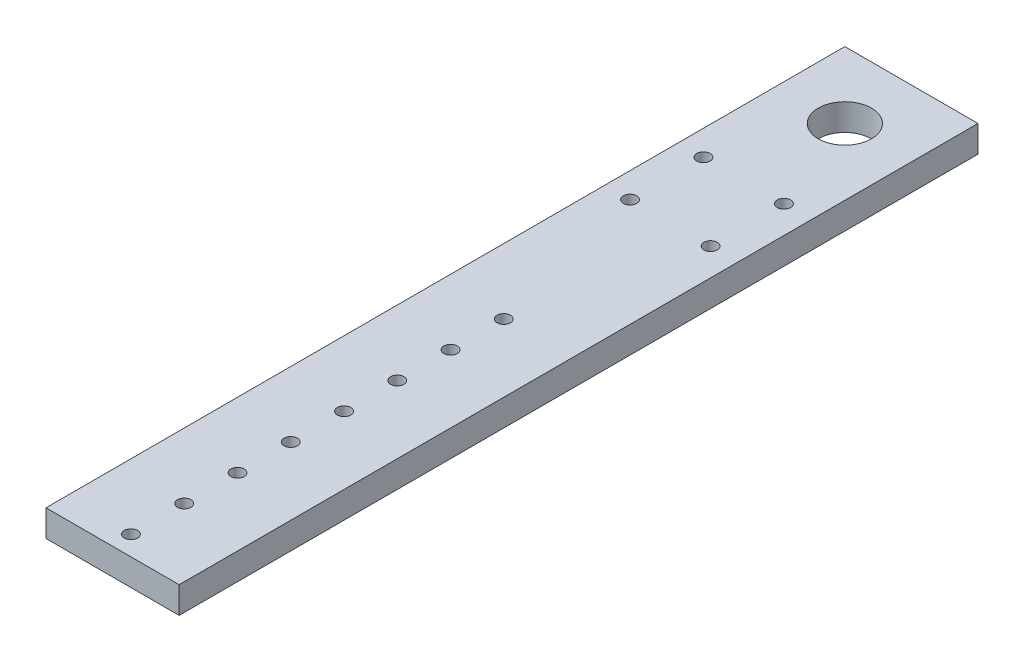
ISO-10303-21;
HEADER;
FILE_DESCRIPTION(('STEP AP214'),'2;1');
FILE_NAME('part.step','',(''),(''),'','','');
FILE_SCHEMA(('AUTOMOTIVE_DESIGN { 1 0 10303 214 1 1 1 1 }'));
ENDSEC;
DATA;
#1=APPLICATION_CONTEXT('core data for automotive mechanical design processes');
#2=APPLICATION_PROTOCOL_DEFINITION('international standard','automotive_design',2000,#1);
#3=PRODUCT_CONTEXT('',#1,'mechanical');
#4=PRODUCT('Part','Part','',(#3));
#5=PRODUCT_RELATED_PRODUCT_CATEGORY('part','',(#4));
#6=PRODUCT_DEFINITION_FORMATION('','',#4);
#7=PRODUCT_DEFINITION_CONTEXT('part definition',#1,'design');
#8=PRODUCT_DEFINITION('design','',#6,#7);
#9=PRODUCT_DEFINITION_SHAPE('','',#8);
#10=(LENGTH_UNIT() NAMED_UNIT(*) SI_UNIT(.MILLI.,.METRE.));
#11=(NAMED_UNIT(*) PLANE_ANGLE_UNIT() SI_UNIT($,.RADIAN.));
#12=(NAMED_UNIT(*) SI_UNIT($,.STERADIAN.) SOLID_ANGLE_UNIT());
#13=UNCERTAINTY_MEASURE_WITH_UNIT(LENGTH_MEASURE(1.E-05),#10,'distance_accuracy_value','');
#14=(GEOMETRIC_REPRESENTATION_CONTEXT(3) GLOBAL_UNCERTAINTY_ASSIGNED_CONTEXT((#13)) GLOBAL_UNIT_ASSIGNED_CONTEXT((#10,
#11,#12)) REPRESENTATION_CONTEXT('',''));
#15=CARTESIAN_POINT('',(0.,0.,0.));
#16=DIRECTION('',(0.,0.,1.));
#17=DIRECTION('',(1.,0.,0.));
#18=AXIS2_PLACEMENT_3D('',#15,#16,#17);
#19=CARTESIAN_POINT('',(0.,25.4,0.));
#20=DIRECTION('',(-1.,0.,0.));
#21=DIRECTION('',(0.,0.,1.));
#22=AXIS2_PLACEMENT_3D('',#19,#20,#21);
#23=PLANE('',#22);
#24=DIRECTION('',(0.,0.,-1.));
#25=VECTOR('',#24,1.);
#26=CARTESIAN_POINT('',(0.,0.,0.));
#27=LINE('',#26,#25);
#28=CARTESIAN_POINT('',(0.,0.,0.));
#29=VERTEX_POINT('',#28);
#30=CARTESIAN_POINT('',(0.,0.,-762.));
#31=VERTEX_POINT('',#30);
#32=EDGE_CURVE('E96',#29,#31,#27,.T.);
#33=ORIENTED_EDGE('',*,*,#32,.T.);
#34=DIRECTION('',(0.,-1.,0.));
#35=VECTOR('',#34,1.);
#36=CARTESIAN_POINT('',(0.,25.4,-762.));
#37=LINE('',#36,#35);
#38=CARTESIAN_POINT('',(0.,25.4,-762.));
#39=VERTEX_POINT('',#38);
#40=EDGE_CURVE('E11',#39,#31,#37,.T.);
#41=ORIENTED_EDGE('',*,*,#40,.F.);
#42=DIRECTION('',(0.,0.,-1.));
#43=VECTOR('',#42,1.);
#44=CARTESIAN_POINT('',(0.,25.4,0.));
#45=LINE('',#44,#43);
#46=CARTESIAN_POINT('',(0.,25.4,0.));
#47=VERTEX_POINT('',#46);
#48=EDGE_CURVE('E82',#47,#39,#45,.T.);
#49=ORIENTED_EDGE('',*,*,#48,.F.);
#50=DIRECTION('',(0.,-1.,0.));
#51=VECTOR('',#50,1.);
#52=CARTESIAN_POINT('',(0.,25.4,0.));
#53=LINE('',#52,#51);
#54=EDGE_CURVE('E49',#47,#29,#53,.T.);
#55=ORIENTED_EDGE('',*,*,#54,.T.);
#56=EDGE_LOOP('',(#33,#41,#49,#55));
#57=FACE_BOUND('',#56,.T.);
#58=ADVANCED_FACE('F33',(#57),#23,.F.);
#59=CARTESIAN_POINT('',(0.,25.4,-762.));
#60=DIRECTION('',(0.,0.,1.));
#61=DIRECTION('',(1.,0.,0.));
#62=AXIS2_PLACEMENT_3D('',#59,#60,#61);
#63=PLANE('',#62);
#64=DIRECTION('',(-1.,0.,0.));
#65=VECTOR('',#64,1.);
#66=CARTESIAN_POINT('',(0.,0.,-762.));
#67=LINE('',#66,#65);
#68=CARTESIAN_POINT('',(-127.,0.,-762.));
#69=VERTEX_POINT('',#68);
#70=EDGE_CURVE('E87',#31,#69,#67,.T.);
#71=ORIENTED_EDGE('',*,*,#70,.T.);
#72=DIRECTION('',(0.,-1.,0.));
#73=VECTOR('',#72,1.);
#74=CARTESIAN_POINT('',(-127.,25.4,-762.));
#75=LINE('',#74,#73);
#76=CARTESIAN_POINT('',(-127.,25.4,-762.));
#77=VERTEX_POINT('',#76);
#78=EDGE_CURVE('E41',#77,#69,#75,.T.);
#79=ORIENTED_EDGE('',*,*,#78,.F.);
#80=DIRECTION('',(-1.,0.,0.));
#81=VECTOR('',#80,1.);
#82=CARTESIAN_POINT('',(0.,25.4,-762.));
#83=LINE('',#82,#81);
#84=EDGE_CURVE('E74',#39,#77,#83,.T.);
#85=ORIENTED_EDGE('',*,*,#84,.F.);
#86=ORIENTED_EDGE('',*,*,#40,.T.);
#87=EDGE_LOOP('',(#71,#79,#85,#86));
#88=FACE_BOUND('',#87,.T.);
#89=ADVANCED_FACE('F86',(#88),#63,.F.);
#90=CARTESIAN_POINT('',(-127.,25.4,0.));
#91=DIRECTION('',(-1.,0.,0.));
#92=DIRECTION('',(0.,0.,1.));
#93=AXIS2_PLACEMENT_3D('',#90,#91,#92);
#94=PLANE('',#93);
#95=DIRECTION('',(0.,0.,-1.));
#96=VECTOR('',#95,1.);
#97=CARTESIAN_POINT('',(-127.,0.,0.));
#98=LINE('',#97,#96);
#99=CARTESIAN_POINT('',(-127.,0.,0.));
#100=VERTEX_POINT('',#99);
#101=EDGE_CURVE('E100',#100,#69,#98,.T.);
#102=ORIENTED_EDGE('',*,*,#101,.F.);
#103=DIRECTION('',(0.,-1.,0.));
#104=VECTOR('',#103,1.);
#105=CARTESIAN_POINT('',(-127.,25.4,0.));
#106=LINE('',#105,#104);
#107=CARTESIAN_POINT('',(-127.,25.4,0.));
#108=VERTEX_POINT('',#107);
#109=EDGE_CURVE('E63',#108,#100,#106,.T.);
#110=ORIENTED_EDGE('',*,*,#109,.F.);
#111=DIRECTION('',(0.,0.,-1.));
#112=VECTOR('',#111,1.);
#113=CARTESIAN_POINT('',(-127.,25.4,0.));
#114=LINE('',#113,#112);
#115=EDGE_CURVE('E81',#108,#77,#114,.T.);
#116=ORIENTED_EDGE('',*,*,#115,.T.);
#117=ORIENTED_EDGE('',*,*,#78,.T.);
#118=EDGE_LOOP('',(#102,#110,#116,#117));
#119=FACE_BOUND('',#118,.T.);
#120=ADVANCED_FACE('F90',(#119),#94,.T.);
#121=CARTESIAN_POINT('',(0.,25.4,0.));
#122=DIRECTION('',(0.,0.,1.));
#123=DIRECTION('',(1.,0.,0.));
#124=AXIS2_PLACEMENT_3D('',#121,#122,#123);
#125=PLANE('',#124);
#126=DIRECTION('',(-1.,0.,0.));
#127=VECTOR('',#126,1.);
#128=CARTESIAN_POINT('',(0.,0.,0.));
#129=LINE('',#128,#127);
#130=EDGE_CURVE('E102',#29,#100,#129,.T.);
#131=ORIENTED_EDGE('',*,*,#130,.F.);
#132=ORIENTED_EDGE('',*,*,#54,.F.);
#133=DIRECTION('',(-1.,0.,0.));
#134=VECTOR('',#133,1.);
#135=CARTESIAN_POINT('',(0.,25.4,0.));
#136=LINE('',#135,#134);
#137=EDGE_CURVE('E91',#47,#108,#136,.T.);
#138=ORIENTED_EDGE('',*,*,#137,.T.);
#139=ORIENTED_EDGE('',*,*,#109,.T.);
#140=EDGE_LOOP('',(#131,#132,#138,#139));
#141=FACE_BOUND('',#140,.T.);
#142=ADVANCED_FACE('F191',(#141),#125,.T.);
#143=CARTESIAN_POINT('',(0.,25.4,0.));
#144=DIRECTION('',(0.,1.,0.));
#145=DIRECTION('',(0.,0.,1.));
#146=AXIS2_PLACEMENT_3D('',#143,#144,#145);
#147=PLANE('',#146);
#148=CARTESIAN_POINT('',(-103.026104377343,25.4,-603.131071739426));
#149=DIRECTION('',(0.,1.,0.));
#150=DIRECTION('',(0.,0.,1.));
#151=AXIS2_PLACEMENT_3D('',#148,#149,#150);
#152=CIRCLE('',#151,6.34999999999999);
#153=CARTESIAN_POINT('',(-103.026104377343,25.4,-596.781071739426));
#154=VERTEX_POINT('',#153);
#155=EDGE_CURVE('E182',#154,#154,#152,.T.);
#156=ORIENTED_EDGE('',*,*,#155,.F.);
#157=EDGE_LOOP('',(#156));
#158=FACE_BOUND('',#157,.T.);
#159=CARTESIAN_POINT('',(-64.6204470928531,25.4,-374.28850318734));
#160=DIRECTION('',(0.,1.,0.));
#161=DIRECTION('',(0.,0.,1.));
#162=AXIS2_PLACEMENT_3D('',#159,#160,#161);
#163=CIRCLE('',#162,6.34999999999999);
#164=CARTESIAN_POINT('',(-64.6204470928531,25.4,-367.93850318734));
#165=VERTEX_POINT('',#164);
#166=EDGE_CURVE('E176',#165,#165,#163,.T.);
#167=ORIENTED_EDGE('',*,*,#166,.F.);
#168=EDGE_LOOP('',(#167));
#169=FACE_BOUND('',#168,.T.);
#170=CARTESIAN_POINT('',(-26.214789808363,25.4,-603.131071739426));
#171=DIRECTION('',(0.,1.,0.));
#172=DIRECTION('',(0.,0.,1.));
#173=AXIS2_PLACEMENT_3D('',#170,#171,#172);
#174=CIRCLE('',#173,6.34999999999999);
#175=CARTESIAN_POINT('',(-26.214789808363,25.4,-596.781071739426));
#176=VERTEX_POINT('',#175);
#177=EDGE_CURVE('E170',#176,#176,#174,.T.);
#178=ORIENTED_EDGE('',*,*,#177,.F.);
#179=EDGE_LOOP('',(#178));
#180=FACE_BOUND('',#179,.T.);
#181=CARTESIAN_POINT('',(-26.2147898083632,25.4,-533.157431447913));
#182=DIRECTION('',(0.,1.,0.));
#183=DIRECTION('',(0.,0.,1.));
#184=AXIS2_PLACEMENT_3D('',#181,#182,#183);
#185=CIRCLE('',#184,6.34999999999999);
#186=CARTESIAN_POINT('',(-26.2147898083632,25.4,-526.807431447913));
#187=VERTEX_POINT('',#186);
#188=EDGE_CURVE('E164',#187,#187,#185,.T.);
#189=ORIENTED_EDGE('',*,*,#188,.F.);
#190=EDGE_LOOP('',(#189));
#191=FACE_BOUND('',#190,.T.);
#192=CARTESIAN_POINT('',(-103.026104377343,25.4,-533.157431447913));
#193=DIRECTION('',(0.,1.,0.));
#194=DIRECTION('',(0.,0.,1.));
#195=AXIS2_PLACEMENT_3D('',#192,#193,#194);
#196=CIRCLE('',#195,6.34999999999998);
#197=CARTESIAN_POINT('',(-103.026104377343,25.4,-526.807431447913));
#198=VERTEX_POINT('',#197);
#199=EDGE_CURVE('E158',#198,#198,#196,.T.);
#200=ORIENTED_EDGE('',*,*,#199,.F.);
#201=EDGE_LOOP('',(#200));
#202=FACE_BOUND('',#201,.T.);
#203=CARTESIAN_POINT('',(-64.6204470928526,25.4,-323.48850318734));
#204=DIRECTION('',(0.,1.,0.));
#205=DIRECTION('',(0.,0.,1.));
#206=AXIS2_PLACEMENT_3D('',#203,#204,#205);
#207=CIRCLE('',#206,6.34999999999999);
#208=CARTESIAN_POINT('',(-64.6204470928526,25.4,-317.13850318734));
#209=VERTEX_POINT('',#208);
#210=EDGE_CURVE('E152',#209,#209,#207,.T.);
#211=ORIENTED_EDGE('',*,*,#210,.F.);
#212=EDGE_LOOP('',(#211));
#213=FACE_BOUND('',#212,.T.);
#214=CARTESIAN_POINT('',(-64.620447092852,25.4,-272.68850318734));
#215=DIRECTION('',(0.,1.,0.));
#216=DIRECTION('',(0.,0.,1.));
#217=AXIS2_PLACEMENT_3D('',#214,#215,#216);
#218=CIRCLE('',#217,6.34999999999999);
#219=CARTESIAN_POINT('',(-64.620447092852,25.4,-266.33850318734));
#220=VERTEX_POINT('',#219);
#221=EDGE_CURVE('E146',#220,#220,#218,.T.);
#222=ORIENTED_EDGE('',*,*,#221,.F.);
#223=EDGE_LOOP('',(#222));
#224=FACE_BOUND('',#223,.T.);
#225=CARTESIAN_POINT('',(-64.6204470928515,25.4,-221.88850318734));
#226=DIRECTION('',(0.,1.,0.));
#227=DIRECTION('',(0.,0.,1.));
#228=AXIS2_PLACEMENT_3D('',#225,#226,#227);
#229=CIRCLE('',#228,6.34999999999999);
#230=CARTESIAN_POINT('',(-64.6204470928515,25.4,-215.53850318734));
#231=VERTEX_POINT('',#230);
#232=EDGE_CURVE('E140',#231,#231,#229,.T.);
#233=ORIENTED_EDGE('',*,*,#232,.F.);
#234=EDGE_LOOP('',(#233));
#235=FACE_BOUND('',#234,.T.);
#236=CARTESIAN_POINT('',(-64.620447092851,25.4,-171.08850318734));
#237=DIRECTION('',(0.,1.,0.));
#238=DIRECTION('',(0.,0.,1.));
#239=AXIS2_PLACEMENT_3D('',#236,#237,#238);
#240=CIRCLE('',#239,6.34999999999999);
#241=CARTESIAN_POINT('',(-64.620447092851,25.4,-164.73850318734));
#242=VERTEX_POINT('',#241);
#243=EDGE_CURVE('E134',#242,#242,#240,.T.);
#244=ORIENTED_EDGE('',*,*,#243,.F.);
#245=EDGE_LOOP('',(#244));
#246=FACE_BOUND('',#245,.T.);
#247=CARTESIAN_POINT('',(-64.6204470928504,25.4,-120.28850318734));
#248=DIRECTION('',(0.,1.,0.));
#249=DIRECTION('',(0.,0.,1.));
#250=AXIS2_PLACEMENT_3D('',#247,#248,#249);
#251=CIRCLE('',#250,6.34999999999999);
#252=CARTESIAN_POINT('',(-64.6204470928504,25.4,-113.93850318734));
#253=VERTEX_POINT('',#252);
#254=EDGE_CURVE('E128',#253,#253,#251,.T.);
#255=ORIENTED_EDGE('',*,*,#254,.F.);
#256=EDGE_LOOP('',(#255));
#257=FACE_BOUND('',#256,.T.);
#258=CARTESIAN_POINT('',(-64.6204470928499,25.4,-69.4885031873398));
#259=DIRECTION('',(0.,1.,0.));
#260=DIRECTION('',(0.,0.,1.));
#261=AXIS2_PLACEMENT_3D('',#258,#259,#260);
#262=CIRCLE('',#261,6.34999999999999);
#263=CARTESIAN_POINT('',(-64.6204470928499,25.4,-63.1385031873398));
#264=VERTEX_POINT('',#263);
#265=EDGE_CURVE('E122',#264,#264,#262,.T.);
#266=ORIENTED_EDGE('',*,*,#265,.F.);
#267=EDGE_LOOP('',(#266));
#268=FACE_BOUND('',#267,.T.);
#269=CARTESIAN_POINT('',(-64.6204470928494,25.4,-18.6885031873398));
#270=DIRECTION('',(0.,1.,0.));
#271=DIRECTION('',(0.,0.,1.));
#272=AXIS2_PLACEMENT_3D('',#269,#270,#271);
#273=CIRCLE('',#272,6.34999999999999);
#274=CARTESIAN_POINT('',(-64.6204470928494,25.4,-12.3385031873398));
#275=VERTEX_POINT('',#274);
#276=EDGE_CURVE('E116',#275,#275,#273,.T.);
#277=ORIENTED_EDGE('',*,*,#276,.F.);
#278=EDGE_LOOP('',(#277));
#279=FACE_BOUND('',#278,.T.);
#280=CARTESIAN_POINT('',(-63.5,25.4,-698.5));
#281=DIRECTION('',(0.,1.,0.));
#282=DIRECTION('',(0.,0.,1.));
#283=AXIS2_PLACEMENT_3D('',#280,#281,#282);
#284=CIRCLE('',#283,25.4);
#285=CARTESIAN_POINT('',(-63.5,25.4,-673.1));
#286=VERTEX_POINT('',#285);
#287=EDGE_CURVE('E110',#286,#286,#284,.T.);
#288=ORIENTED_EDGE('',*,*,#287,.F.);
#289=EDGE_LOOP('',(#288));
#290=FACE_BOUND('',#289,.T.);
#291=ORIENTED_EDGE('',*,*,#48,.T.);
#292=ORIENTED_EDGE('',*,*,#84,.T.);
#293=ORIENTED_EDGE('',*,*,#115,.F.);
#294=ORIENTED_EDGE('',*,*,#137,.F.);
#295=EDGE_LOOP('',(#291,#292,#293,#294));
#296=FACE_BOUND('',#295,.T.);
#297=ADVANCED_FACE('F78',(#158,#169,#180,#191,#202,#213,#224,#235,#246,#257,#268,#279,#290,
#296),#147,.T.);
#298=CARTESIAN_POINT('',(0.,0.,0.));
#299=DIRECTION('',(0.,1.,0.));
#300=DIRECTION('',(0.,0.,1.));
#301=AXIS2_PLACEMENT_3D('',#298,#299,#300);
#302=PLANE('',#301);
#303=CARTESIAN_POINT('',(-103.026104377343,0.,-603.131071739426));
#304=DIRECTION('',(0.,1.,0.));
#305=DIRECTION('',(0.,0.,1.));
#306=AXIS2_PLACEMENT_3D('',#303,#304,#305);
#307=CIRCLE('',#306,6.34999999999998);
#308=CARTESIAN_POINT('',(-103.026104377343,0.,-596.781071739426));
#309=VERTEX_POINT('',#308);
#310=EDGE_CURVE('E179',#309,#309,#307,.T.);
#311=ORIENTED_EDGE('',*,*,#310,.T.);
#312=EDGE_LOOP('',(#311));
#313=FACE_BOUND('',#312,.T.);
#314=CARTESIAN_POINT('',(-64.6204470928531,0.,-374.28850318734));
#315=DIRECTION('',(0.,1.,0.));
#316=DIRECTION('',(0.,0.,1.));
#317=AXIS2_PLACEMENT_3D('',#314,#315,#316);
#318=CIRCLE('',#317,6.34999999999999);
#319=CARTESIAN_POINT('',(-64.6204470928531,0.,-367.93850318734));
#320=VERTEX_POINT('',#319);
#321=EDGE_CURVE('E173',#320,#320,#318,.T.);
#322=ORIENTED_EDGE('',*,*,#321,.T.);
#323=EDGE_LOOP('',(#322));
#324=FACE_BOUND('',#323,.T.);
#325=CARTESIAN_POINT('',(-26.214789808363,0.,-603.131071739426));
#326=DIRECTION('',(0.,1.,0.));
#327=DIRECTION('',(0.,0.,1.));
#328=AXIS2_PLACEMENT_3D('',#325,#326,#327);
#329=CIRCLE('',#328,6.34999999999999);
#330=CARTESIAN_POINT('',(-26.214789808363,0.,-596.781071739426));
#331=VERTEX_POINT('',#330);
#332=EDGE_CURVE('E167',#331,#331,#329,.T.);
#333=ORIENTED_EDGE('',*,*,#332,.T.);
#334=EDGE_LOOP('',(#333));
#335=FACE_BOUND('',#334,.T.);
#336=CARTESIAN_POINT('',(-26.2147898083632,0.,-533.157431447913));
#337=DIRECTION('',(0.,1.,0.));
#338=DIRECTION('',(0.,0.,1.));
#339=AXIS2_PLACEMENT_3D('',#336,#337,#338);
#340=CIRCLE('',#339,6.34999999999999);
#341=CARTESIAN_POINT('',(-26.2147898083632,0.,-526.807431447913));
#342=VERTEX_POINT('',#341);
#343=EDGE_CURVE('E161',#342,#342,#340,.T.);
#344=ORIENTED_EDGE('',*,*,#343,.T.);
#345=EDGE_LOOP('',(#344));
#346=FACE_BOUND('',#345,.T.);
#347=CARTESIAN_POINT('',(-103.026104377343,0.,-533.157431447913));
#348=DIRECTION('',(0.,1.,0.));
#349=DIRECTION('',(0.,0.,1.));
#350=AXIS2_PLACEMENT_3D('',#347,#348,#349);
#351=CIRCLE('',#350,6.34999999999998);
#352=CARTESIAN_POINT('',(-103.026104377343,0.,-526.807431447913));
#353=VERTEX_POINT('',#352);
#354=EDGE_CURVE('E155',#353,#353,#351,.T.);
#355=ORIENTED_EDGE('',*,*,#354,.T.);
#356=EDGE_LOOP('',(#355));
#357=FACE_BOUND('',#356,.T.);
#358=CARTESIAN_POINT('',(-64.6204470928526,0.,-323.48850318734));
#359=DIRECTION('',(0.,1.,0.));
#360=DIRECTION('',(0.,0.,1.));
#361=AXIS2_PLACEMENT_3D('',#358,#359,#360);
#362=CIRCLE('',#361,6.34999999999999);
#363=CARTESIAN_POINT('',(-64.6204470928526,0.,-317.13850318734));
#364=VERTEX_POINT('',#363);
#365=EDGE_CURVE('E149',#364,#364,#362,.T.);
#366=ORIENTED_EDGE('',*,*,#365,.T.);
#367=EDGE_LOOP('',(#366));
#368=FACE_BOUND('',#367,.T.);
#369=CARTESIAN_POINT('',(-64.620447092852,0.,-272.68850318734));
#370=DIRECTION('',(0.,1.,0.));
#371=DIRECTION('',(0.,0.,1.));
#372=AXIS2_PLACEMENT_3D('',#369,#370,#371);
#373=CIRCLE('',#372,6.34999999999999);
#374=CARTESIAN_POINT('',(-64.620447092852,0.,-266.33850318734));
#375=VERTEX_POINT('',#374);
#376=EDGE_CURVE('E143',#375,#375,#373,.T.);
#377=ORIENTED_EDGE('',*,*,#376,.T.);
#378=EDGE_LOOP('',(#377));
#379=FACE_BOUND('',#378,.T.);
#380=CARTESIAN_POINT('',(-64.6204470928515,0.,-221.88850318734));
#381=DIRECTION('',(0.,1.,0.));
#382=DIRECTION('',(0.,0.,1.));
#383=AXIS2_PLACEMENT_3D('',#380,#381,#382);
#384=CIRCLE('',#383,6.34999999999999);
#385=CARTESIAN_POINT('',(-64.6204470928515,0.,-215.53850318734));
#386=VERTEX_POINT('',#385);
#387=EDGE_CURVE('E137',#386,#386,#384,.T.);
#388=ORIENTED_EDGE('',*,*,#387,.T.);
#389=EDGE_LOOP('',(#388));
#390=FACE_BOUND('',#389,.T.);
#391=CARTESIAN_POINT('',(-64.620447092851,0.,-171.08850318734));
#392=DIRECTION('',(0.,1.,0.));
#393=DIRECTION('',(0.,0.,1.));
#394=AXIS2_PLACEMENT_3D('',#391,#392,#393);
#395=CIRCLE('',#394,6.34999999999999);
#396=CARTESIAN_POINT('',(-64.620447092851,0.,-164.73850318734));
#397=VERTEX_POINT('',#396);
#398=EDGE_CURVE('E131',#397,#397,#395,.T.);
#399=ORIENTED_EDGE('',*,*,#398,.T.);
#400=EDGE_LOOP('',(#399));
#401=FACE_BOUND('',#400,.T.);
#402=CARTESIAN_POINT('',(-64.6204470928504,0.,-120.28850318734));
#403=DIRECTION('',(0.,1.,0.));
#404=DIRECTION('',(0.,0.,1.));
#405=AXIS2_PLACEMENT_3D('',#402,#403,#404);
#406=CIRCLE('',#405,6.34999999999999);
#407=CARTESIAN_POINT('',(-64.6204470928504,0.,-113.93850318734));
#408=VERTEX_POINT('',#407);
#409=EDGE_CURVE('E125',#408,#408,#406,.T.);
#410=ORIENTED_EDGE('',*,*,#409,.T.);
#411=EDGE_LOOP('',(#410));
#412=FACE_BOUND('',#411,.T.);
#413=CARTESIAN_POINT('',(-64.6204470928499,0.,-69.4885031873398));
#414=DIRECTION('',(0.,1.,0.));
#415=DIRECTION('',(0.,0.,1.));
#416=AXIS2_PLACEMENT_3D('',#413,#414,#415);
#417=CIRCLE('',#416,6.34999999999999);
#418=CARTESIAN_POINT('',(-64.6204470928499,0.,-63.1385031873398));
#419=VERTEX_POINT('',#418);
#420=EDGE_CURVE('E119',#419,#419,#417,.T.);
#421=ORIENTED_EDGE('',*,*,#420,.T.);
#422=EDGE_LOOP('',(#421));
#423=FACE_BOUND('',#422,.T.);
#424=CARTESIAN_POINT('',(-64.6204470928494,0.,-18.6885031873398));
#425=DIRECTION('',(0.,1.,0.));
#426=DIRECTION('',(0.,0.,1.));
#427=AXIS2_PLACEMENT_3D('',#424,#425,#426);
#428=CIRCLE('',#427,6.34999999999999);
#429=CARTESIAN_POINT('',(-64.6204470928494,0.,-12.3385031873398));
#430=VERTEX_POINT('',#429);
#431=EDGE_CURVE('E113',#430,#430,#428,.T.);
#432=ORIENTED_EDGE('',*,*,#431,.T.);
#433=EDGE_LOOP('',(#432));
#434=FACE_BOUND('',#433,.T.);
#435=CARTESIAN_POINT('',(-63.5,0.,-698.5));
#436=DIRECTION('',(0.,1.,0.));
#437=DIRECTION('',(0.,0.,1.));
#438=AXIS2_PLACEMENT_3D('',#435,#436,#437);
#439=CIRCLE('',#438,25.4);
#440=CARTESIAN_POINT('',(-63.5,0.,-673.1));
#441=VERTEX_POINT('',#440);
#442=EDGE_CURVE('E98',#441,#441,#439,.T.);
#443=ORIENTED_EDGE('',*,*,#442,.T.);
#444=EDGE_LOOP('',(#443));
#445=FACE_BOUND('',#444,.T.);
#446=ORIENTED_EDGE('',*,*,#32,.F.);
#447=ORIENTED_EDGE('',*,*,#130,.T.);
#448=ORIENTED_EDGE('',*,*,#101,.T.);
#449=ORIENTED_EDGE('',*,*,#70,.F.);
#450=EDGE_LOOP('',(#446,#447,#448,#449));
#451=FACE_BOUND('',#450,.T.);
#452=ADVANCED_FACE('F190',(#313,#324,#335,#346,#357,#368,#379,#390,#401,#412,#423,#434,#445,
#451),#302,.F.);
#453=CARTESIAN_POINT('',(-63.5,25.4,-698.5));
#454=DIRECTION('',(0.,1.,0.));
#455=DIRECTION('',(0.,0.,1.));
#456=AXIS2_PLACEMENT_3D('',#453,#454,#455);
#457=CYLINDRICAL_SURFACE('',#456,25.4);
#458=ORIENTED_EDGE('',*,*,#442,.F.);
#459=EDGE_LOOP('',(#458));
#460=FACE_BOUND('',#459,.T.);
#461=ORIENTED_EDGE('',*,*,#287,.T.);
#462=EDGE_LOOP('',(#461));
#463=FACE_BOUND('',#462,.T.);
#464=ADVANCED_FACE('F217',(#460,#463),#457,.F.);
#465=CARTESIAN_POINT('',(-64.6204470928494,25.4,-18.6885031873398));
#466=DIRECTION('',(0.,1.,0.));
#467=DIRECTION('',(0.,0.,1.));
#468=AXIS2_PLACEMENT_3D('',#465,#466,#467);
#469=CYLINDRICAL_SURFACE('',#468,6.34999999999999);
#470=ORIENTED_EDGE('',*,*,#431,.F.);
#471=EDGE_LOOP('',(#470));
#472=FACE_BOUND('',#471,.T.);
#473=ORIENTED_EDGE('',*,*,#276,.T.);
#474=EDGE_LOOP('',(#473));
#475=FACE_BOUND('',#474,.T.);
#476=ADVANCED_FACE('F219',(#472,#475),#469,.F.);
#477=CARTESIAN_POINT('',(-64.6204470928499,25.4,-69.4885031873398));
#478=DIRECTION('',(0.,1.,0.));
#479=DIRECTION('',(0.,0.,1.));
#480=AXIS2_PLACEMENT_3D('',#477,#478,#479);
#481=CYLINDRICAL_SURFACE('',#480,6.34999999999999);
#482=ORIENTED_EDGE('',*,*,#420,.F.);
#483=EDGE_LOOP('',(#482));
#484=FACE_BOUND('',#483,.T.);
#485=ORIENTED_EDGE('',*,*,#265,.T.);
#486=EDGE_LOOP('',(#485));
#487=FACE_BOUND('',#486,.T.);
#488=ADVANCED_FACE('F226',(#484,#487),#481,.F.);
#489=CARTESIAN_POINT('',(-64.6204470928504,25.4,-120.28850318734));
#490=DIRECTION('',(0.,1.,0.));
#491=DIRECTION('',(0.,0.,1.));
#492=AXIS2_PLACEMENT_3D('',#489,#490,#491);
#493=CYLINDRICAL_SURFACE('',#492,6.34999999999999);
#494=ORIENTED_EDGE('',*,*,#409,.F.);
#495=EDGE_LOOP('',(#494));
#496=FACE_BOUND('',#495,.T.);
#497=ORIENTED_EDGE('',*,*,#254,.T.);
#498=EDGE_LOOP('',(#497));
#499=FACE_BOUND('',#498,.T.);
#500=ADVANCED_FACE('F287',(#496,#499),#493,.F.);
#501=CARTESIAN_POINT('',(-64.620447092851,25.4,-171.08850318734));
#502=DIRECTION('',(0.,1.,0.));
#503=DIRECTION('',(0.,0.,1.));
#504=AXIS2_PLACEMENT_3D('',#501,#502,#503);
#505=CYLINDRICAL_SURFACE('',#504,6.34999999999999);
#506=ORIENTED_EDGE('',*,*,#398,.F.);
#507=EDGE_LOOP('',(#506));
#508=FACE_BOUND('',#507,.T.);
#509=ORIENTED_EDGE('',*,*,#243,.T.);
#510=EDGE_LOOP('',(#509));
#511=FACE_BOUND('',#510,.T.);
#512=ADVANCED_FACE('F296',(#508,#511),#505,.F.);
#513=CARTESIAN_POINT('',(-64.6204470928515,25.4,-221.88850318734));
#514=DIRECTION('',(0.,1.,0.));
#515=DIRECTION('',(0.,0.,1.));
#516=AXIS2_PLACEMENT_3D('',#513,#514,#515);
#517=CYLINDRICAL_SURFACE('',#516,6.34999999999999);
#518=ORIENTED_EDGE('',*,*,#387,.F.);
#519=EDGE_LOOP('',(#518));
#520=FACE_BOUND('',#519,.T.);
#521=ORIENTED_EDGE('',*,*,#232,.T.);
#522=EDGE_LOOP('',(#521));
#523=FACE_BOUND('',#522,.T.);
#524=ADVANCED_FACE('F305',(#520,#523),#517,.F.);
#525=CARTESIAN_POINT('',(-64.620447092852,25.4,-272.68850318734));
#526=DIRECTION('',(0.,1.,0.));
#527=DIRECTION('',(0.,0.,1.));
#528=AXIS2_PLACEMENT_3D('',#525,#526,#527);
#529=CYLINDRICAL_SURFACE('',#528,6.34999999999999);
#530=ORIENTED_EDGE('',*,*,#376,.F.);
#531=EDGE_LOOP('',(#530));
#532=FACE_BOUND('',#531,.T.);
#533=ORIENTED_EDGE('',*,*,#221,.T.);
#534=EDGE_LOOP('',(#533));
#535=FACE_BOUND('',#534,.T.);
#536=ADVANCED_FACE('F314',(#532,#535),#529,.F.);
#537=CARTESIAN_POINT('',(-64.6204470928526,25.4,-323.48850318734));
#538=DIRECTION('',(0.,1.,0.));
#539=DIRECTION('',(0.,0.,1.));
#540=AXIS2_PLACEMENT_3D('',#537,#538,#539);
#541=CYLINDRICAL_SURFACE('',#540,6.34999999999999);
#542=ORIENTED_EDGE('',*,*,#365,.F.);
#543=EDGE_LOOP('',(#542));
#544=FACE_BOUND('',#543,.T.);
#545=ORIENTED_EDGE('',*,*,#210,.T.);
#546=EDGE_LOOP('',(#545));
#547=FACE_BOUND('',#546,.T.);
#548=ADVANCED_FACE('F323',(#544,#547),#541,.F.);
#549=CARTESIAN_POINT('',(-103.026104377343,25.4,-533.157431447913));
#550=DIRECTION('',(0.,1.,0.));
#551=DIRECTION('',(0.,0.,1.));
#552=AXIS2_PLACEMENT_3D('',#549,#550,#551);
#553=CYLINDRICAL_SURFACE('',#552,6.34999999999998);
#554=ORIENTED_EDGE('',*,*,#354,.F.);
#555=EDGE_LOOP('',(#554));
#556=FACE_BOUND('',#555,.T.);
#557=ORIENTED_EDGE('',*,*,#199,.T.);
#558=EDGE_LOOP('',(#557));
#559=FACE_BOUND('',#558,.T.);
#560=ADVANCED_FACE('F332',(#556,#559),#553,.F.);
#561=CARTESIAN_POINT('',(-26.2147898083632,25.4,-533.157431447913));
#562=DIRECTION('',(0.,1.,0.));
#563=DIRECTION('',(0.,0.,1.));
#564=AXIS2_PLACEMENT_3D('',#561,#562,#563);
#565=CYLINDRICAL_SURFACE('',#564,6.34999999999999);
#566=ORIENTED_EDGE('',*,*,#343,.F.);
#567=EDGE_LOOP('',(#566));
#568=FACE_BOUND('',#567,.T.);
#569=ORIENTED_EDGE('',*,*,#188,.T.);
#570=EDGE_LOOP('',(#569));
#571=FACE_BOUND('',#570,.T.);
#572=ADVANCED_FACE('F341',(#568,#571),#565,.F.);
#573=CARTESIAN_POINT('',(-26.214789808363,25.4,-603.131071739426));
#574=DIRECTION('',(0.,1.,0.));
#575=DIRECTION('',(0.,0.,1.));
#576=AXIS2_PLACEMENT_3D('',#573,#574,#575);
#577=CYLINDRICAL_SURFACE('',#576,6.34999999999999);
#578=ORIENTED_EDGE('',*,*,#332,.F.);
#579=EDGE_LOOP('',(#578));
#580=FACE_BOUND('',#579,.T.);
#581=ORIENTED_EDGE('',*,*,#177,.T.);
#582=EDGE_LOOP('',(#581));
#583=FACE_BOUND('',#582,.T.);
#584=ADVANCED_FACE('F350',(#580,#583),#577,.F.);
#585=CARTESIAN_POINT('',(-64.6204470928531,25.4,-374.28850318734));
#586=DIRECTION('',(0.,1.,0.));
#587=DIRECTION('',(0.,0.,1.));
#588=AXIS2_PLACEMENT_3D('',#585,#586,#587);
#589=CYLINDRICAL_SURFACE('',#588,6.34999999999999);
#590=ORIENTED_EDGE('',*,*,#321,.F.);
#591=EDGE_LOOP('',(#590));
#592=FACE_BOUND('',#591,.T.);
#593=ORIENTED_EDGE('',*,*,#166,.T.);
#594=EDGE_LOOP('',(#593));
#595=FACE_BOUND('',#594,.T.);
#596=ADVANCED_FACE('F359',(#592,#595),#589,.F.);
#597=CARTESIAN_POINT('',(-103.026104377343,25.4,-603.131071739426));
#598=DIRECTION('',(0.,1.,0.));
#599=DIRECTION('',(0.,0.,1.));
#600=AXIS2_PLACEMENT_3D('',#597,#598,#599);
#601=CYLINDRICAL_SURFACE('',#600,6.34999999999999);
#602=ORIENTED_EDGE('',*,*,#310,.F.);
#603=EDGE_LOOP('',(#602));
#604=FACE_BOUND('',#603,.T.);
#605=ORIENTED_EDGE('',*,*,#155,.T.);
#606=EDGE_LOOP('',(#605));
#607=FACE_BOUND('',#606,.T.);
#608=ADVANCED_FACE('F186',(#604,#607),#601,.F.);
#609=CLOSED_SHELL('',(#58,#89,#120,#142,#297,#452,#464,#476,#488,#500,#512,#524,#536,#548,#560,
#572,#584,#596,#608));
#610=MANIFOLD_SOLID_BREP('B2',#609);
#611=ADVANCED_BREP_SHAPE_REPRESENTATION('',(#18,#610),#14);
#612=SHAPE_DEFINITION_REPRESENTATION(#9,#611);
ENDSEC;
END-ISO-10303-21;
